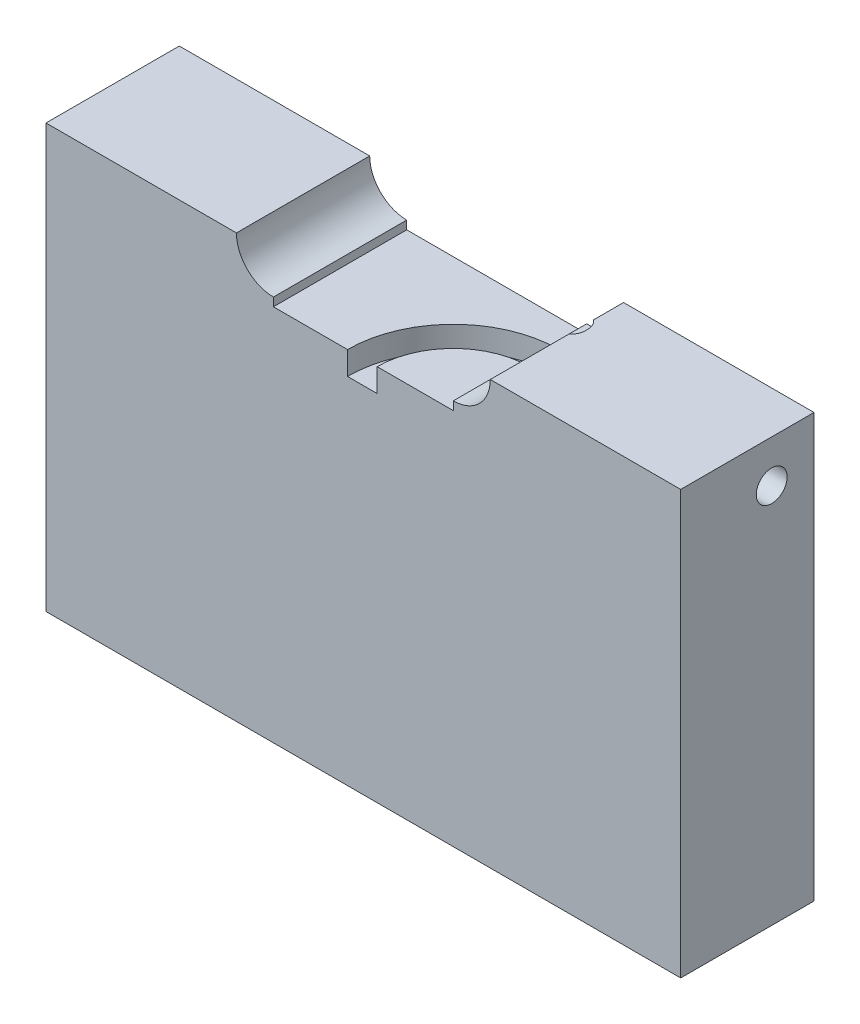
ISO-10303-21;
HEADER;
FILE_DESCRIPTION(('STEP AP214'),'2;1');
FILE_NAME('part.step','',(''),(''),'','','');
FILE_SCHEMA(('AUTOMOTIVE_DESIGN { 1 0 10303 214 1 1 1 1 }'));
ENDSEC;
DATA;
#1=APPLICATION_CONTEXT('core data for automotive mechanical design processes');
#2=APPLICATION_PROTOCOL_DEFINITION('international standard','automotive_design',2000,#1);
#3=PRODUCT_CONTEXT('',#1,'mechanical');
#4=PRODUCT('Part','Part','',(#3));
#5=PRODUCT_RELATED_PRODUCT_CATEGORY('part','',(#4));
#6=PRODUCT_DEFINITION_FORMATION('','',#4);
#7=PRODUCT_DEFINITION_CONTEXT('part definition',#1,'design');
#8=PRODUCT_DEFINITION('design','',#6,#7);
#9=PRODUCT_DEFINITION_SHAPE('','',#8);
#10=(LENGTH_UNIT() NAMED_UNIT(*) SI_UNIT(.MILLI.,.METRE.));
#11=(NAMED_UNIT(*) PLANE_ANGLE_UNIT() SI_UNIT($,.RADIAN.));
#12=(NAMED_UNIT(*) SI_UNIT($,.STERADIAN.) SOLID_ANGLE_UNIT());
#13=UNCERTAINTY_MEASURE_WITH_UNIT(LENGTH_MEASURE(1.E-05),#10,'distance_accuracy_value','');
#14=(GEOMETRIC_REPRESENTATION_CONTEXT(3) GLOBAL_UNCERTAINTY_ASSIGNED_CONTEXT((#13)) GLOBAL_UNIT_ASSIGNED_CONTEXT((#10,
#11,#12)) REPRESENTATION_CONTEXT('',''));
#15=CARTESIAN_POINT('',(0.,0.,0.));
#16=DIRECTION('',(0.,0.,1.));
#17=DIRECTION('',(1.,0.,0.));
#18=AXIS2_PLACEMENT_3D('',#15,#16,#17);
#19=CARTESIAN_POINT('',(5.3975,25.4,4.0005));
#20=DIRECTION('',(0.,-1.,0.));
#21=DIRECTION('',(1.,0.,0.));
#22=AXIS2_PLACEMENT_3D('',#19,#20,#21);
#23=CYLINDRICAL_SURFACE('',#22,6.35);
#24=DIRECTION('',(0.,-1.,0.));
#25=VECTOR('',#24,1.);
#26=CARTESIAN_POINT('',(5.3975,25.4,-2.3495));
#27=LINE('',#26,#25);
#28=CARTESIAN_POINT('',(5.3975,22.6695,-2.3495));
#29=VERTEX_POINT('',#28);
#30=CARTESIAN_POINT('',(5.3975,21.2725,-2.3495));
#31=VERTEX_POINT('',#30);
#32=EDGE_CURVE('E452',#29,#31,#27,.T.);
#33=ORIENTED_EDGE('',*,*,#32,.F.);
#34=CARTESIAN_POINT('',(5.3975,22.6695,4.0005));
#35=DIRECTION('',(0.,1.,0.));
#36=DIRECTION('',(-1.,0.,0.));
#37=AXIS2_PLACEMENT_3D('',#34,#35,#36);
#38=CIRCLE('',#37,6.35);
#39=CARTESIAN_POINT('',(-0.9525,22.6695,4.0005));
#40=VERTEX_POINT('',#39);
#41=EDGE_CURVE('E239',#29,#40,#38,.T.);
#42=ORIENTED_EDGE('',*,*,#41,.T.);
#43=DIRECTION('',(0.,-1.,0.));
#44=VECTOR('',#43,1.);
#45=CARTESIAN_POINT('',(-0.952499999999999,25.4,4.0005));
#46=LINE('',#45,#44);
#47=CARTESIAN_POINT('',(-0.952500000000001,21.2725,4.0005));
#48=VERTEX_POINT('',#47);
#49=EDGE_CURVE('E230',#40,#48,#46,.T.);
#50=ORIENTED_EDGE('',*,*,#49,.T.);
#51=CARTESIAN_POINT('',(5.3975,21.2725,4.0005));
#52=DIRECTION('',(0.,1.,0.));
#53=DIRECTION('',(-1.,0.,0.));
#54=AXIS2_PLACEMENT_3D('',#51,#52,#53);
#55=CIRCLE('',#54,6.35);
#56=EDGE_CURVE('E468',#31,#48,#55,.T.);
#57=ORIENTED_EDGE('',*,*,#56,.F.);
#58=EDGE_LOOP('',(#33,#42,#50,#57));
#59=FACE_BOUND('',#58,.T.);
#60=ADVANCED_FACE('F33',(#59),#23,.F.);
#61=CARTESIAN_POINT('',(5.3975,25.4,4.0005));
#62=DIRECTION('',(0.,-1.,0.));
#63=DIRECTION('',(1.,0.,0.));
#64=AXIS2_PLACEMENT_3D('',#61,#62,#63);
#65=CYLINDRICAL_SURFACE('',#64,4.572);
#66=DIRECTION('',(0.,-1.,0.));
#67=VECTOR('',#66,1.);
#68=CARTESIAN_POINT('',(0.825500000000001,25.4,4.0005));
#69=LINE('',#68,#67);
#70=CARTESIAN_POINT('',(0.8255,22.6695,4.0005));
#71=VERTEX_POINT('',#70);
#72=CARTESIAN_POINT('',(0.825499999999999,21.2725,4.0005));
#73=VERTEX_POINT('',#72);
#74=EDGE_CURVE('E450',#71,#73,#69,.T.);
#75=ORIENTED_EDGE('',*,*,#74,.F.);
#76=CARTESIAN_POINT('',(5.3975,22.6695,4.0005));
#77=DIRECTION('',(0.,1.,0.));
#78=DIRECTION('',(-1.,0.,0.));
#79=AXIS2_PLACEMENT_3D('',#76,#77,#78);
#80=CIRCLE('',#79,4.572);
#81=CARTESIAN_POINT('',(5.3975,22.6695,-0.571499999999999));
#82=VERTEX_POINT('',#81);
#83=EDGE_CURVE('E11',#71,#82,#80,.F.);
#84=ORIENTED_EDGE('',*,*,#83,.T.);
#85=DIRECTION('',(0.,-1.,0.));
#86=VECTOR('',#85,1.);
#87=CARTESIAN_POINT('',(5.3975,25.4,-0.571499999999999));
#88=LINE('',#87,#86);
#89=CARTESIAN_POINT('',(5.3975,21.2725,-0.571499999999999));
#90=VERTEX_POINT('',#89);
#91=EDGE_CURVE('E428',#82,#90,#88,.T.);
#92=ORIENTED_EDGE('',*,*,#91,.T.);
#93=CARTESIAN_POINT('',(5.3975,21.2725,4.0005));
#94=DIRECTION('',(0.,-1.,0.));
#95=DIRECTION('',(-1.,0.,0.));
#96=AXIS2_PLACEMENT_3D('',#93,#94,#95);
#97=CIRCLE('',#96,4.572);
#98=EDGE_CURVE('E444',#73,#90,#97,.T.);
#99=ORIENTED_EDGE('',*,*,#98,.F.);
#100=EDGE_LOOP('',(#75,#84,#92,#99));
#101=FACE_BOUND('',#100,.T.);
#102=ADVANCED_FACE('F515',(#101),#65,.T.);
#103=CARTESIAN_POINT('',(7.14375,25.4,-1.36525));
#104=DIRECTION('',(0.,-1.,0.));
#105=DIRECTION('',(1.,0.,0.));
#106=AXIS2_PLACEMENT_3D('',#103,#104,#105);
#107=CYLINDRICAL_SURFACE('',#106,0.79375);
#108=CARTESIAN_POINT('',(7.14375,23.1230464027505,-0.571499999999999));
#109=CARTESIAN_POINT('',(7.15893791785662,23.1229781622669,-0.57148921704763));
#110=CARTESIAN_POINT('',(7.17400569118337,23.124520458918,-0.571934888400934));
#111=CARTESIAN_POINT('',(7.2033431203434,23.1300966910771,-0.573609679749041));
#112=CARTESIAN_POINT('',(7.2176225803887,23.1340818079715,-0.574823464377439));
#113=CARTESIAN_POINT('',(7.25380469471549,23.1468082711699,-0.578843564999055));
#114=CARTESIAN_POINT('',(7.27512209176527,23.1569686475094,-0.582168697431571));
#115=CARTESIAN_POINT('',(7.31633968048021,23.1797623078841,-0.590203083478792));
#116=CARTESIAN_POINT('',(7.3362195987784,23.1924240312471,-0.594928600893243));
#117=CARTESIAN_POINT('',(7.37787042940221,23.2211125710446,-0.606458135167337));
#118=CARTESIAN_POINT('',(7.39943301006975,23.2373533586215,-0.613473986199112));
#119=CARTESIAN_POINT('',(7.44138305141542,23.270593693588,-0.629075213734984));
#120=CARTESIAN_POINT('',(7.46176933083153,23.2875939742988,-0.637662133053712));
#121=CARTESIAN_POINT('',(7.52143193640342,23.3389203174978,-0.665728056056787));
#122=CARTESIAN_POINT('',(7.5593005677582,23.3736393239732,-0.687537596010284));
#123=CARTESIAN_POINT('',(7.6384185132863,23.448430775985,-0.742299278746401));
#124=CARTESIAN_POINT('',(7.67896795887997,23.4882846809269,-0.776574581298044));
#125=CARTESIAN_POINT('',(7.75403094099642,23.5640168410449,-0.854840077472445));
#126=CARTESIAN_POINT('',(7.78855810799547,23.5999040050053,-0.898807808999805));
#127=CARTESIAN_POINT('',(7.83769152755565,23.6526476479051,-0.97824481695104));
#128=CARTESIAN_POINT('',(7.85491185054323,23.6715928274382,-1.01071440914583));
#129=CARTESIAN_POINT('',(7.88511096397852,23.7059280219605,-1.07921260408973));
#130=CARTESIAN_POINT('',(7.89810333803432,23.721329374934,-1.11522931488016));
#131=CARTESIAN_POINT('',(7.91781786866114,23.7462994434745,-1.18619777652733));
#132=CARTESIAN_POINT('',(7.92506881061526,23.7563207127409,-1.22083829691442));
#133=CARTESIAN_POINT('',(7.93245517265906,23.768352232104,-1.27409390820124));
#134=CARTESIAN_POINT('',(7.93433608261142,23.7718715687023,-1.29214513676568));
#135=CARTESIAN_POINT('',(7.93686009185863,23.7778440916586,-1.3285246385013));
#136=CARTESIAN_POINT('',(7.93750208529729,23.7802963240094,-1.34685314447942));
#137=CARTESIAN_POINT('',(7.9375,23.782194040048,-1.36525));
#138=B_SPLINE_CURVE_WITH_KNOTS('',3,(#108,#109,#110,#111,#112,#113,#114,#115,#116,#117,#118,
#119,#120,#121,#122,#123,#124,#125,#126,#127,#128,#129,#130,#131,#132,#133,#134,#135,#136,#137),
.UNSPECIFIED.,.F.,.F.,(4,2,2,2,2,2,2,2,2,2,2,2,2,2,4),(0.,0.0452895664750743,0.0897022840237438,
0.160849075138673,0.232856893385683,0.316417547963794,0.400060705247954,0.567007309525601,
0.765293828106061,0.963125562501132,1.08674096362218,1.2099551978823,1.31975004138663,
1.37514445888962,1.43058829859037),.UNSPECIFIED.);
#139=CARTESIAN_POINT('',(7.14375,23.1230464027505,-0.571499999999999));
#140=VERTEX_POINT('',#139);
#141=CARTESIAN_POINT('',(7.9375,23.782194040048,-1.36525));
#142=VERTEX_POINT('',#141);
#143=EDGE_CURVE('E288',#140,#142,#138,.T.);
#144=ORIENTED_EDGE('',*,*,#143,.F.);
#145=DIRECTION('',(0.,-1.,0.));
#146=VECTOR('',#145,1.);
#147=CARTESIAN_POINT('',(7.14375,25.4,-0.571499999999999));
#148=LINE('',#147,#146);
#149=CARTESIAN_POINT('',(7.14375,24.0251846714922,-0.571499999999999));
#150=VERTEX_POINT('',#149);
#151=EDGE_CURVE('E420',#150,#140,#148,.T.);
#152=ORIENTED_EDGE('',*,*,#151,.F.);
#153=CARTESIAN_POINT('',(7.14375,24.0251846714922,-0.571499999999999));
#154=CARTESIAN_POINT('',(7.17493882903404,24.0647904593139,-0.571515966067028));
#155=CARTESIAN_POINT('',(7.20473558813774,24.1054189700609,-0.573336101510383));
#156=CARTESIAN_POINT('',(7.26136996565832,24.1883868944046,-0.579743127296266));
#157=CARTESIAN_POINT('',(7.28821258149453,24.2307232477426,-0.58432525746599));
#158=CARTESIAN_POINT('',(7.3389098633342,24.316975133551,-0.595428843915839));
#159=CARTESIAN_POINT('',(7.36275997006245,24.3608929475555,-0.601953209514282));
#160=CARTESIAN_POINT('',(7.40738778736858,24.4500808312739,-0.616195180263885));
#161=CARTESIAN_POINT('',(7.4281640525646,24.4953515251891,-0.623913343295498));
#162=CARTESIAN_POINT('',(7.48841301880205,24.6391746871459,-0.648856798326211));
#163=CARTESIAN_POINT('',(7.52239504808017,24.7399758849743,-0.666944970405778));
#164=CARTESIAN_POINT('',(7.56234987491672,24.89428448952,-0.690674889170688));
#165=CARTESIAN_POINT('',(7.57382524483121,24.9461801786835,-0.698011648198737));
#166=CARTESIAN_POINT('',(7.59305267803054,25.0508824439455,-0.710803547908302));
#167=CARTESIAN_POINT('',(7.6008067955423,25.1036885007802,-0.716259726248792));
#168=CARTESIAN_POINT('',(7.61108668898027,25.1970681393693,-0.723637621390587));
#169=CARTESIAN_POINT('',(7.6144233283184,25.2375119988091,-0.726094970736021));
#170=CARTESIAN_POINT('',(7.61888265518496,25.3186335235272,-0.729411979066943));
#171=CARTESIAN_POINT('',(7.62000273710662,25.359311407665,-0.730269757657389));
#172=CARTESIAN_POINT('',(7.62,25.4,-0.730250000000001));
#173=B_SPLINE_CURVE_WITH_KNOTS('',3,(#153,#154,#155,#156,#157,#158,#159,#160,#161,#162,#163,
#164,#165,#166,#167,#168,#169,#170,#171,#172),.UNSPECIFIED.,.F.,.F.,(4,2,2,2,2,2,2,2,2,4),(0.,
0.151091968467235,0.301924278346462,0.452983670059184,0.604113868697302,0.926493060198708,
1.08733203777103,1.2480821256733,1.36996150858661,1.49198407820245),.UNSPECIFIED.);
#174=CARTESIAN_POINT('',(7.62,25.4,-0.730250000000001));
#175=VERTEX_POINT('',#174);
#176=EDGE_CURVE('E310',#150,#175,#173,.T.);
#177=ORIENTED_EDGE('',*,*,#176,.T.);
#178=CARTESIAN_POINT('',(7.14375,25.4,-1.36525));
#179=DIRECTION('',(0.,1.,0.));
#180=DIRECTION('',(1.,0.,0.));
#181=AXIS2_PLACEMENT_3D('',#178,#179,#180);
#182=CIRCLE('',#181,0.79375);
#183=CARTESIAN_POINT('',(7.9375,25.4,-1.36525));
#184=VERTEX_POINT('',#183);
#185=EDGE_CURVE('E438',#175,#184,#182,.T.);
#186=ORIENTED_EDGE('',*,*,#185,.T.);
#187=DIRECTION('',(0.,-1.,0.));
#188=VECTOR('',#187,1.);
#189=CARTESIAN_POINT('',(7.9375,25.4,-1.36525));
#190=LINE('',#189,#188);
#191=EDGE_CURVE('E355',#184,#142,#190,.T.);
#192=ORIENTED_EDGE('',*,*,#191,.T.);
#193=EDGE_LOOP('',(#144,#152,#177,#186,#192));
#194=FACE_BOUND('',#193,.T.);
#195=ADVANCED_FACE('F302',(#194),#107,.F.);
#196=CARTESIAN_POINT('',(7.14375,25.4,-1.55575));
#197=DIRECTION('',(0.,-1.,0.));
#198=DIRECTION('',(1.,0.,0.));
#199=AXIS2_PLACEMENT_3D('',#196,#197,#198);
#200=CYLINDRICAL_SURFACE('',#199,0.79375);
#201=CARTESIAN_POINT('',(7.9375,23.782194040048,-1.55575));
#202=CARTESIAN_POINT('',(7.93750241256332,23.7801936525798,-1.57514478348495));
#203=CARTESIAN_POINT('',(7.93678870871886,23.7775767551003,-1.5944621743929));
#204=CARTESIAN_POINT('',(7.93398641219166,23.7711587801819,-1.63277953405351));
#205=CARTESIAN_POINT('',(7.93189915885152,23.7673588582055,-1.65177979355258));
#206=CARTESIAN_POINT('',(7.92371352293545,23.7543339271178,-1.70775715508424));
#207=CARTESIAN_POINT('',(7.91568889593077,23.7434433707352,-1.74408855282001));
#208=CARTESIAN_POINT('',(7.89523776010599,23.7179176659708,-1.81387248338225));
#209=CARTESIAN_POINT('',(7.88282703010999,23.7032959918654,-1.8473348082929));
#210=CARTESIAN_POINT('',(7.85435108605226,23.6709943364583,-1.9111502135495));
#211=CARTESIAN_POINT('',(7.83827706911013,23.6533070133269,-1.9414955446917));
#212=CARTESIAN_POINT('',(7.7950458041358,23.6068268517615,-2.01212150391445));
#213=CARTESIAN_POINT('',(7.76620526596445,23.5766872046281,-2.05048526942747));
#214=CARTESIAN_POINT('',(7.7038617611406,23.5131883580013,-2.12011411534587));
#215=CARTESIAN_POINT('',(7.67034850885851,23.4798221071251,-2.1513631238535));
#216=CARTESIAN_POINT('',(7.59865541927082,23.4104677895308,-2.20785803437785));
#217=CARTESIAN_POINT('',(7.56037261542772,23.3744328617208,-2.23291527401671));
#218=CARTESIAN_POINT('',(7.50013032175957,23.3206006600362,-2.26536164838984));
#219=CARTESIAN_POINT('',(7.47959277776842,23.3027037493227,-2.27531618012629));
#220=CARTESIAN_POINT('',(7.43740812370541,23.2673727822183,-2.29353925463318));
#221=CARTESIAN_POINT('',(7.41576180347948,23.249938409412,-2.30180897725127));
#222=CARTESIAN_POINT('',(7.37545059999081,23.2195567149893,-2.31516497950012));
#223=CARTESIAN_POINT('',(7.35704266951005,23.206403873353,-2.32055739616009));
#224=CARTESIAN_POINT('',(7.31896103433901,23.1815037640402,-2.33017004709823));
#225=CARTESIAN_POINT('',(7.29928734644972,23.169756477713,-2.33439029693117));
#226=CARTESIAN_POINT('',(7.26442510912181,23.1521227309386,-2.34040819331776));
#227=CARTESIAN_POINT('',(7.2496600372804,23.1455350172339,-2.34255282231827));
#228=CARTESIAN_POINT('',(7.21928974650044,23.134519893377,-2.34604332277608));
#229=CARTESIAN_POINT('',(7.20368955538529,23.1300808834197,-2.34739349186303));
#230=CARTESIAN_POINT('',(7.18055609109638,23.1258076177804,-2.34867942917183));
#231=CARTESIAN_POINT('',(7.17325894960944,23.1247822406778,-2.34898501857166));
#232=CARTESIAN_POINT('',(7.15856018619976,23.1233972488647,-2.34939622095228));
#233=CARTESIAN_POINT('',(7.15115822518164,23.1230409698786,-2.34950083203409));
#234=CARTESIAN_POINT('',(7.14375,23.1230464027505,-2.3495));
#235=B_SPLINE_CURVE_WITH_KNOTS('',3,(#201,#202,#203,#204,#205,#206,#207,#208,#209,#210,#211,
#212,#213,#214,#215,#216,#217,#218,#219,#220,#221,#222,#223,#224,#225,#226,#227,#228,#229,#230,
#231,#232,#233,#234),.UNSPECIFIED.,.F.,.F.,(4,2,2,2,2,2,2,2,2,2,2,2,2,2,2,2,4),(0.,
0.0584453265147484,0.116833747504299,0.232488737897986,0.347731829907224,0.463254826944109,
0.632339979221334,0.801803378714479,0.975925812136694,1.06288483108186,1.14978274295621,
1.21949579483512,1.28920792157083,1.33802178064912,1.38656909412918,1.40866379827516,
1.43086836401874),.UNSPECIFIED.);
#236=CARTESIAN_POINT('',(7.9375,23.782194040048,-1.55575));
#237=VERTEX_POINT('',#236);
#238=CARTESIAN_POINT('',(7.14375,23.1230464027505,-2.3495));
#239=VERTEX_POINT('',#238);
#240=EDGE_CURVE('E283',#237,#239,#235,.T.);
#241=ORIENTED_EDGE('',*,*,#240,.F.);
#242=DIRECTION('',(0.,-1.,0.));
#243=VECTOR('',#242,1.);
#244=CARTESIAN_POINT('',(7.9375,25.4,-1.55575));
#245=LINE('',#244,#243);
#246=CARTESIAN_POINT('',(7.9375,25.4,-1.55575));
#247=VERTEX_POINT('',#246);
#248=EDGE_CURVE('E345',#247,#237,#245,.T.);
#249=ORIENTED_EDGE('',*,*,#248,.F.);
#250=CARTESIAN_POINT('',(7.14375,25.4,-1.55575));
#251=DIRECTION('',(0.,1.,0.));
#252=DIRECTION('',(-1.,0.,0.));
#253=AXIS2_PLACEMENT_3D('',#250,#251,#252);
#254=CIRCLE('',#253,0.79375);
#255=CARTESIAN_POINT('',(7.62,25.4,-2.19075));
#256=VERTEX_POINT('',#255);
#257=EDGE_CURVE('E441',#247,#256,#254,.T.);
#258=ORIENTED_EDGE('',*,*,#257,.T.);
#259=CARTESIAN_POINT('',(7.62,25.4,-2.19075));
#260=CARTESIAN_POINT('',(7.62000808222504,25.3476620086764,-2.19069678540611));
#261=CARTESIAN_POINT('',(7.61815174304964,25.2953473715379,-2.19213629686457));
#262=CARTESIAN_POINT('',(7.61078125391763,25.1911829924741,-2.19758908145641));
#263=CARTESIAN_POINT('',(7.60527233116839,25.1393326933517,-2.20159867627471));
#264=CARTESIAN_POINT('',(7.59066211493761,25.0363268479517,-2.21178576557001));
#265=CARTESIAN_POINT('',(7.58155825030525,24.9851718260926,-2.21796481131604));
#266=CARTESIAN_POINT('',(7.55984658447069,24.8838125931217,-2.23181870998652));
#267=CARTESIAN_POINT('',(7.5472375453096,24.8336087246421,-2.23949409110067));
#268=CARTESIAN_POINT('',(7.50289921844771,24.6799016765049,-2.26443820747756));
#269=CARTESIAN_POINT('',(7.46535418005992,24.5782472369929,-2.2830066799425));
#270=CARTESIAN_POINT('',(7.37568261057651,24.3812061917664,-2.31636202096677));
#271=CARTESIAN_POINT('',(7.32360883953244,24.2857984212855,-2.33116220863326));
#272=CARTESIAN_POINT('',(7.2458227786617,24.1653311257623,-2.3431368661238));
#273=CARTESIAN_POINT('',(7.22636452973083,24.1366863514485,-2.34544747485569));
#274=CARTESIAN_POINT('',(7.18607326983955,24.0802594935604,-2.34862852535922));
#275=CARTESIAN_POINT('',(7.16523897881772,24.0524782496364,-2.34949760595795));
#276=CARTESIAN_POINT('',(7.14375,24.0251846714922,-2.3495));
#277=B_SPLINE_CURVE_WITH_KNOTS('',3,(#259,#260,#261,#262,#263,#264,#265,#266,#267,#268,#269,
#270,#271,#272,#273,#274,#275,#276),.UNSPECIFIED.,.F.,.F.,(4,2,2,2,2,2,2,2,4),(0.,
0.156923704265639,0.313623318561808,0.470435210112986,0.627302555066314,0.955983364493301,
1.28348578985539,1.38754499314609,1.49170239923896),.UNSPECIFIED.);
#278=CARTESIAN_POINT('',(7.14375,24.0251846714922,-2.3495));
#279=VERTEX_POINT('',#278);
#280=EDGE_CURVE('E321',#256,#279,#277,.T.);
#281=ORIENTED_EDGE('',*,*,#280,.T.);
#282=DIRECTION('',(0.,-1.,0.));
#283=VECTOR('',#282,1.);
#284=CARTESIAN_POINT('',(7.14375,25.4,-2.3495));
#285=LINE('',#284,#283);
#286=EDGE_CURVE('E348',#279,#239,#285,.T.);
#287=ORIENTED_EDGE('',*,*,#286,.T.);
#288=EDGE_LOOP('',(#241,#249,#258,#281,#287));
#289=FACE_BOUND('',#288,.T.);
#290=ADVANCED_FACE('F344',(#289),#200,.F.);
#291=CARTESIAN_POINT('',(7.9375,25.4,-1.36525));
#292=DIRECTION('',(-1.,0.,0.));
#293=DIRECTION('',(0.,-1.,0.));
#294=AXIS2_PLACEMENT_3D('',#291,#292,#293);
#295=PLANE('',#294);
#296=CARTESIAN_POINT('',(7.9375,22.86,-1.4605));
#297=DIRECTION('',(-1.,0.,0.));
#298=DIRECTION('',(0.,-1.,0.));
#299=AXIS2_PLACEMENT_3D('',#296,#297,#298);
#300=CIRCLE('',#299,0.9271);
#301=EDGE_CURVE('E327',#142,#237,#300,.T.);
#302=ORIENTED_EDGE('',*,*,#301,.F.);
#303=ORIENTED_EDGE('',*,*,#191,.F.);
#304=DIRECTION('',(0.,0.,-1.));
#305=VECTOR('',#304,1.);
#306=CARTESIAN_POINT('',(7.9375,25.4,-1.36525));
#307=LINE('',#306,#305);
#308=EDGE_CURVE('E351',#184,#247,#307,.T.);
#309=ORIENTED_EDGE('',*,*,#308,.T.);
#310=ORIENTED_EDGE('',*,*,#248,.T.);
#311=EDGE_LOOP('',(#302,#303,#309,#310));
#312=FACE_BOUND('',#311,.T.);
#313=ADVANCED_FACE('F349',(#312),#295,.T.);
#314=CARTESIAN_POINT('',(-19.05,25.4,4.0005));
#315=DIRECTION('',(0.,0.,-1.));
#316=DIRECTION('',(-1.,0.,0.));
#317=AXIS2_PLACEMENT_3D('',#314,#315,#316);
#318=PLANE('',#317);
#319=DIRECTION('',(1.,0.,0.));
#320=VECTOR('',#319,1.);
#321=CARTESIAN_POINT('',(-5.3975,22.6695,4.0005));
#322=LINE('',#321,#320);
#323=CARTESIAN_POINT('',(-5.3975,22.6695,4.0005));
#324=VERTEX_POINT('',#323);
#325=EDGE_CURVE('E221',#324,#40,#322,.T.);
#326=ORIENTED_EDGE('',*,*,#325,.F.);
#327=DIRECTION('',(0.,1.,0.));
#328=VECTOR('',#327,1.);
#329=CARTESIAN_POINT('',(-5.3975,22.6695,4.0005));
#330=LINE('',#329,#328);
#331=CARTESIAN_POINT('',(-5.3975,23.1775,4.0005));
#332=VERTEX_POINT('',#331);
#333=EDGE_CURVE('E205',#324,#332,#330,.T.);
#334=ORIENTED_EDGE('',*,*,#333,.T.);
#335=CARTESIAN_POINT('',(-5.3975,25.4,4.0005));
#336=DIRECTION('',(0.,0.,-1.));
#337=DIRECTION('',(-1.,0.,0.));
#338=AXIS2_PLACEMENT_3D('',#335,#336,#337);
#339=CIRCLE('',#338,2.2225);
#340=CARTESIAN_POINT('',(-7.62,25.4,4.0005));
#341=VERTEX_POINT('',#340);
#342=EDGE_CURVE('E372',#332,#341,#339,.T.);
#343=ORIENTED_EDGE('',*,*,#342,.T.);
#344=DIRECTION('',(1.,0.,0.));
#345=VECTOR('',#344,1.);
#346=CARTESIAN_POINT('',(-19.05,25.4,4.0005));
#347=LINE('',#346,#345);
#348=CARTESIAN_POINT('',(-19.05,25.4,4.0005));
#349=VERTEX_POINT('',#348);
#350=EDGE_CURVE('E386',#349,#341,#347,.T.);
#351=ORIENTED_EDGE('',*,*,#350,.F.);
#352=DIRECTION('',(0.,-1.,0.));
#353=VECTOR('',#352,1.);
#354=CARTESIAN_POINT('',(-19.05,25.4,4.0005));
#355=LINE('',#354,#353);
#356=CARTESIAN_POINT('',(-19.05,0.,4.0005));
#357=VERTEX_POINT('',#356);
#358=EDGE_CURVE('E399',#349,#357,#355,.T.);
#359=ORIENTED_EDGE('',*,*,#358,.T.);
#360=DIRECTION('',(1.,0.,0.));
#361=VECTOR('',#360,1.);
#362=CARTESIAN_POINT('',(-19.05,0.,4.0005));
#363=LINE('',#362,#361);
#364=CARTESIAN_POINT('',(19.05,0.,4.0005));
#365=VERTEX_POINT('',#364);
#366=EDGE_CURVE('E379',#357,#365,#363,.T.);
#367=ORIENTED_EDGE('',*,*,#366,.T.);
#368=DIRECTION('',(0.,-1.,0.));
#369=VECTOR('',#368,1.);
#370=CARTESIAN_POINT('',(19.05,25.4,4.0005));
#371=LINE('',#370,#369);
#372=CARTESIAN_POINT('',(19.05,25.4,4.0005));
#373=VERTEX_POINT('',#372);
#374=EDGE_CURVE('E389',#373,#365,#371,.T.);
#375=ORIENTED_EDGE('',*,*,#374,.F.);
#376=CARTESIAN_POINT('',(7.61999999999999,25.4,4.0005));
#377=VERTEX_POINT('',#376);
#378=EDGE_CURVE('E385',#377,#373,#347,.T.);
#379=ORIENTED_EDGE('',*,*,#378,.F.);
#380=CARTESIAN_POINT('',(5.3975,25.4,4.0005));
#381=DIRECTION('',(0.,0.,-1.));
#382=DIRECTION('',(-1.,0.,0.));
#383=AXIS2_PLACEMENT_3D('',#380,#381,#382);
#384=CIRCLE('',#383,2.2225);
#385=CARTESIAN_POINT('',(5.3975,23.1775,4.0005));
#386=VERTEX_POINT('',#385);
#387=EDGE_CURVE('E367',#377,#386,#384,.T.);
#388=ORIENTED_EDGE('',*,*,#387,.T.);
#389=DIRECTION('',(0.,1.,0.));
#390=VECTOR('',#389,1.);
#391=CARTESIAN_POINT('',(5.3975,22.6695,4.0005));
#392=LINE('',#391,#390);
#393=CARTESIAN_POINT('',(5.3975,22.6695,4.0005));
#394=VERTEX_POINT('',#393);
#395=EDGE_CURVE('E216',#394,#386,#392,.T.);
#396=ORIENTED_EDGE('',*,*,#395,.F.);
#397=EDGE_CURVE('E225',#71,#394,#322,.T.);
#398=ORIENTED_EDGE('',*,*,#397,.F.);
#399=ORIENTED_EDGE('',*,*,#74,.T.);
#400=DIRECTION('',(1.,0.,0.));
#401=VECTOR('',#400,1.);
#402=CARTESIAN_POINT('',(0.825499999999999,21.2725,4.0005));
#403=LINE('',#402,#401);
#404=EDGE_CURVE('E471',#48,#73,#403,.T.);
#405=ORIENTED_EDGE('',*,*,#404,.F.);
#406=ORIENTED_EDGE('',*,*,#49,.F.);
#407=EDGE_LOOP('',(#326,#334,#343,#351,#359,#367,#375,#379,#388,#396,#398,#399,#405,#406));
#408=FACE_BOUND('',#407,.T.);
#409=ADVANCED_FACE('F228',(#408),#318,.F.);
#410=CARTESIAN_POINT('',(0.,25.4,0.));
#411=DIRECTION('',(0.,-1.,0.));
#412=DIRECTION('',(0.,0.,-1.));
#413=AXIS2_PLACEMENT_3D('',#410,#411,#412);
#414=PLANE('',#413);
#415=ORIENTED_EDGE('',*,*,#185,.F.);
#416=DIRECTION('',(0.,0.,-1.));
#417=VECTOR('',#416,1.);
#418=CARTESIAN_POINT('',(7.62,25.4,21.3995));
#419=LINE('',#418,#417);
#420=EDGE_CURVE('E408',#175,#377,#419,.F.);
#421=ORIENTED_EDGE('',*,*,#420,.T.);
#422=ORIENTED_EDGE('',*,*,#378,.T.);
#423=DIRECTION('',(0.,0.,-1.));
#424=VECTOR('',#423,1.);
#425=CARTESIAN_POINT('',(19.05,25.4,4.0005));
#426=LINE('',#425,#424);
#427=CARTESIAN_POINT('',(19.05,25.4,-4.0005));
#428=VERTEX_POINT('',#427);
#429=EDGE_CURVE('E375',#373,#428,#426,.T.);
#430=ORIENTED_EDGE('',*,*,#429,.T.);
#431=DIRECTION('',(-1.,0.,0.));
#432=VECTOR('',#431,1.);
#433=CARTESIAN_POINT('',(-19.05,25.4,-4.0005));
#434=LINE('',#433,#432);
#435=CARTESIAN_POINT('',(7.62,25.4,-4.0005));
#436=VERTEX_POINT('',#435);
#437=EDGE_CURVE('E380',#428,#436,#434,.T.);
#438=ORIENTED_EDGE('',*,*,#437,.T.);
#439=EDGE_CURVE('E409',#436,#256,#419,.F.);
#440=ORIENTED_EDGE('',*,*,#439,.T.);
#441=ORIENTED_EDGE('',*,*,#257,.F.);
#442=ORIENTED_EDGE('',*,*,#308,.F.);
#443=EDGE_LOOP('',(#415,#421,#422,#430,#438,#440,#441,#442));
#444=FACE_BOUND('',#443,.T.);
#445=ADVANCED_FACE('F436',(#444),#414,.F.);
#446=CARTESIAN_POINT('',(5.3975,25.4,21.3995));
#447=DIRECTION('',(0.,0.,-1.));
#448=DIRECTION('',(-1.,0.,0.));
#449=AXIS2_PLACEMENT_3D('',#446,#447,#448);
#450=CYLINDRICAL_SURFACE('',#449,2.2225);
#451=ORIENTED_EDGE('',*,*,#280,.F.);
#452=ORIENTED_EDGE('',*,*,#439,.F.);
#453=CARTESIAN_POINT('',(5.3975,25.4,-4.0005));
#454=DIRECTION('',(0.,0.,-1.));
#455=DIRECTION('',(-1.,0.,0.));
#456=AXIS2_PLACEMENT_3D('',#453,#454,#455);
#457=CIRCLE('',#456,2.2225);
#458=CARTESIAN_POINT('',(5.3975,23.1775,-4.0005));
#459=VERTEX_POINT('',#458);
#460=EDGE_CURVE('E362',#436,#459,#457,.T.);
#461=ORIENTED_EDGE('',*,*,#460,.T.);
#462=DIRECTION('',(0.,0.,-1.));
#463=VECTOR('',#462,1.);
#464=CARTESIAN_POINT('',(5.3975,23.1775,21.3995));
#465=LINE('',#464,#463);
#466=CARTESIAN_POINT('',(5.3975,23.1775,-2.3495));
#467=VERTEX_POINT('',#466);
#468=EDGE_CURVE('E365',#467,#459,#465,.T.);
#469=ORIENTED_EDGE('',*,*,#468,.F.);
#470=CARTESIAN_POINT('',(5.3975,25.4,-2.3495));
#471=DIRECTION('',(0.,0.,1.));
#472=DIRECTION('',(1.,0.,0.));
#473=AXIS2_PLACEMENT_3D('',#470,#471,#472);
#474=CIRCLE('',#473,2.2225);
#475=EDGE_CURVE('E316',#279,#467,#474,.F.);
#476=ORIENTED_EDGE('',*,*,#475,.F.);
#477=EDGE_LOOP('',(#451,#452,#461,#469,#476));
#478=FACE_BOUND('',#477,.T.);
#479=ADVANCED_FACE('F304',(#478),#450,.F.);
#480=ORIENTED_EDGE('',*,*,#176,.F.);
#481=CARTESIAN_POINT('',(5.3975,25.4,-0.571499999999999));
#482=DIRECTION('',(0.,0.,-1.));
#483=DIRECTION('',(-1.,0.,0.));
#484=AXIS2_PLACEMENT_3D('',#481,#482,#483);
#485=CIRCLE('',#484,2.2225);
#486=CARTESIAN_POINT('',(5.3975,23.1775,-0.571499999999999));
#487=VERTEX_POINT('',#486);
#488=EDGE_CURVE('E317',#487,#150,#485,.F.);
#489=ORIENTED_EDGE('',*,*,#488,.F.);
#490=EDGE_CURVE('E368',#386,#487,#465,.T.);
#491=ORIENTED_EDGE('',*,*,#490,.F.);
#492=ORIENTED_EDGE('',*,*,#387,.F.);
#493=ORIENTED_EDGE('',*,*,#420,.F.);
#494=EDGE_LOOP('',(#480,#489,#491,#492,#493));
#495=FACE_BOUND('',#494,.T.);
#496=ADVANCED_FACE('F432',(#495),#450,.F.);
#497=ORIENTED_EDGE('',*,*,#350,.T.);
#498=DIRECTION('',(0.,0.,-1.));
#499=VECTOR('',#498,1.);
#500=CARTESIAN_POINT('',(-7.62,25.4,21.3995));
#501=LINE('',#500,#499);
#502=CARTESIAN_POINT('',(-7.62,25.4,-4.0005));
#503=VERTEX_POINT('',#502);
#504=EDGE_CURVE('E411',#341,#503,#501,.T.);
#505=ORIENTED_EDGE('',*,*,#504,.T.);
#506=CARTESIAN_POINT('',(-19.05,25.4,-4.0005));
#507=VERTEX_POINT('',#506);
#508=EDGE_CURVE('E378',#503,#507,#434,.T.);
#509=ORIENTED_EDGE('',*,*,#508,.T.);
#510=DIRECTION('',(0.,0.,1.));
#511=VECTOR('',#510,1.);
#512=CARTESIAN_POINT('',(-19.05,25.4,4.0005));
#513=LINE('',#512,#511);
#514=EDGE_CURVE('E383',#507,#349,#513,.T.);
#515=ORIENTED_EDGE('',*,*,#514,.T.);
#516=EDGE_LOOP('',(#497,#505,#509,#515));
#517=FACE_BOUND('',#516,.T.);
#518=ADVANCED_FACE('F572',(#517),#414,.F.);
#519=CARTESIAN_POINT('',(19.05,25.4,4.0005));
#520=DIRECTION('',(-1.,0.,0.));
#521=DIRECTION('',(0.,0.,1.));
#522=AXIS2_PLACEMENT_3D('',#519,#520,#521);
#523=PLANE('',#522);
#524=CARTESIAN_POINT('',(19.05,22.86,-1.4605));
#525=DIRECTION('',(1.,0.,0.));
#526=DIRECTION('',(0.,0.,-1.));
#527=AXIS2_PLACEMENT_3D('',#524,#525,#526);
#528=CIRCLE('',#527,0.9271);
#529=CARTESIAN_POINT('',(19.05,22.86,-2.3876));
#530=VERTEX_POINT('',#529);
#531=EDGE_CURVE('E245',#530,#530,#528,.T.);
#532=ORIENTED_EDGE('',*,*,#531,.F.);
#533=EDGE_LOOP('',(#532));
#534=FACE_BOUND('',#533,.T.);
#535=DIRECTION('',(0.,0.,-1.));
#536=VECTOR('',#535,1.);
#537=CARTESIAN_POINT('',(19.05,0.,4.0005));
#538=LINE('',#537,#536);
#539=CARTESIAN_POINT('',(19.05,0.,-4.0005));
#540=VERTEX_POINT('',#539);
#541=EDGE_CURVE('E374',#365,#540,#538,.T.);
#542=ORIENTED_EDGE('',*,*,#541,.T.);
#543=DIRECTION('',(0.,-1.,0.));
#544=VECTOR('',#543,1.);
#545=CARTESIAN_POINT('',(19.05,25.4,-4.0005));
#546=LINE('',#545,#544);
#547=EDGE_CURVE('E405',#428,#540,#546,.T.);
#548=ORIENTED_EDGE('',*,*,#547,.F.);
#549=ORIENTED_EDGE('',*,*,#429,.F.);
#550=ORIENTED_EDGE('',*,*,#374,.T.);
#551=EDGE_LOOP('',(#542,#548,#549,#550));
#552=FACE_BOUND('',#551,.T.);
#553=ADVANCED_FACE('F35',(#534,#552),#523,.F.);
#554=CARTESIAN_POINT('',(-19.05,25.4,-4.0005));
#555=DIRECTION('',(0.,0.,1.));
#556=DIRECTION('',(1.,0.,0.));
#557=AXIS2_PLACEMENT_3D('',#554,#555,#556);
#558=PLANE('',#557);
#559=CARTESIAN_POINT('',(-5.3975,25.4,-4.0005));
#560=DIRECTION('',(0.,0.,-1.));
#561=DIRECTION('',(-1.,0.,0.));
#562=AXIS2_PLACEMENT_3D('',#559,#560,#561);
#563=CIRCLE('',#562,2.2225);
#564=CARTESIAN_POINT('',(-5.3975,23.1775,-4.0005));
#565=VERTEX_POINT('',#564);
#566=EDGE_CURVE('E360',#565,#503,#563,.T.);
#567=ORIENTED_EDGE('',*,*,#566,.F.);
#568=DIRECTION('',(0.,1.,0.));
#569=VECTOR('',#568,1.);
#570=CARTESIAN_POINT('',(-5.3975,22.6695,-4.0005));
#571=LINE('',#570,#569);
#572=CARTESIAN_POINT('',(-5.3975,22.6695,-4.0005));
#573=VERTEX_POINT('',#572);
#574=EDGE_CURVE('E237',#573,#565,#571,.T.);
#575=ORIENTED_EDGE('',*,*,#574,.F.);
#576=DIRECTION('',(-1.,0.,0.));
#577=VECTOR('',#576,1.);
#578=CARTESIAN_POINT('',(-5.3975,22.6695,-4.0005));
#579=LINE('',#578,#577);
#580=CARTESIAN_POINT('',(5.3975,22.6695,-4.0005));
#581=VERTEX_POINT('',#580);
#582=EDGE_CURVE('E217',#581,#573,#579,.T.);
#583=ORIENTED_EDGE('',*,*,#582,.F.);
#584=DIRECTION('',(0.,1.,0.));
#585=VECTOR('',#584,1.);
#586=CARTESIAN_POINT('',(5.3975,22.6695,-4.0005));
#587=LINE('',#586,#585);
#588=EDGE_CURVE('E240',#581,#459,#587,.T.);
#589=ORIENTED_EDGE('',*,*,#588,.T.);
#590=ORIENTED_EDGE('',*,*,#460,.F.);
#591=ORIENTED_EDGE('',*,*,#437,.F.);
#592=ORIENTED_EDGE('',*,*,#547,.T.);
#593=DIRECTION('',(-1.,0.,0.));
#594=VECTOR('',#593,1.);
#595=CARTESIAN_POINT('',(-19.05,0.,-4.0005));
#596=LINE('',#595,#594);
#597=CARTESIAN_POINT('',(-19.05,0.,-4.0005));
#598=VERTEX_POINT('',#597);
#599=EDGE_CURVE('E392',#540,#598,#596,.T.);
#600=ORIENTED_EDGE('',*,*,#599,.T.);
#601=DIRECTION('',(0.,-1.,0.));
#602=VECTOR('',#601,1.);
#603=CARTESIAN_POINT('',(-19.05,25.4,-4.0005));
#604=LINE('',#603,#602);
#605=EDGE_CURVE('E402',#507,#598,#604,.T.);
#606=ORIENTED_EDGE('',*,*,#605,.F.);
#607=ORIENTED_EDGE('',*,*,#508,.F.);
#608=EDGE_LOOP('',(#567,#575,#583,#589,#590,#591,#592,#600,#606,#607));
#609=FACE_BOUND('',#608,.T.);
#610=ADVANCED_FACE('F578',(#609),#558,.F.);
#611=CARTESIAN_POINT('',(-19.05,25.4,4.0005));
#612=DIRECTION('',(1.,0.,0.));
#613=DIRECTION('',(0.,0.,-1.));
#614=AXIS2_PLACEMENT_3D('',#611,#612,#613);
#615=PLANE('',#614);
#616=DIRECTION('',(0.,0.,1.));
#617=VECTOR('',#616,1.);
#618=CARTESIAN_POINT('',(-19.05,0.,4.0005));
#619=LINE('',#618,#617);
#620=EDGE_CURVE('E394',#598,#357,#619,.T.);
#621=ORIENTED_EDGE('',*,*,#620,.T.);
#622=ORIENTED_EDGE('',*,*,#358,.F.);
#623=ORIENTED_EDGE('',*,*,#514,.F.);
#624=ORIENTED_EDGE('',*,*,#605,.T.);
#625=EDGE_LOOP('',(#621,#622,#623,#624));
#626=FACE_BOUND('',#625,.T.);
#627=ADVANCED_FACE('F583',(#626),#615,.F.);
#628=CARTESIAN_POINT('',(0.,0.,0.));
#629=DIRECTION('',(0.,-1.,0.));
#630=DIRECTION('',(0.,0.,-1.));
#631=AXIS2_PLACEMENT_3D('',#628,#629,#630);
#632=PLANE('',#631);
#633=ORIENTED_EDGE('',*,*,#541,.F.);
#634=ORIENTED_EDGE('',*,*,#366,.F.);
#635=ORIENTED_EDGE('',*,*,#620,.F.);
#636=ORIENTED_EDGE('',*,*,#599,.F.);
#637=EDGE_LOOP('',(#633,#634,#635,#636));
#638=FACE_BOUND('',#637,.T.);
#639=ADVANCED_FACE('F594',(#638),#632,.T.);
#640=CARTESIAN_POINT('',(-5.3975,25.4,21.3995));
#641=DIRECTION('',(0.,0.,-1.));
#642=DIRECTION('',(-1.,0.,0.));
#643=AXIS2_PLACEMENT_3D('',#640,#641,#642);
#644=CYLINDRICAL_SURFACE('',#643,2.2225);
#645=DIRECTION('',(0.,0.,-1.));
#646=VECTOR('',#645,1.);
#647=CARTESIAN_POINT('',(-5.3975,23.1775,21.3995));
#648=LINE('',#647,#646);
#649=EDGE_CURVE('E211',#332,#565,#648,.T.);
#650=ORIENTED_EDGE('',*,*,#649,.T.);
#651=ORIENTED_EDGE('',*,*,#566,.T.);
#652=ORIENTED_EDGE('',*,*,#504,.F.);
#653=ORIENTED_EDGE('',*,*,#342,.F.);
#654=EDGE_LOOP('',(#650,#651,#652,#653));
#655=FACE_BOUND('',#654,.T.);
#656=ADVANCED_FACE('F300',(#655),#644,.F.);
#657=CARTESIAN_POINT('',(7.9375,21.937805959952,-1.36525));
#658=CARTESIAN_POINT('',(7.93750241256332,21.9398063474202,-1.34585521651505));
#659=CARTESIAN_POINT('',(7.93678870871886,21.9424232448997,-1.3265378256071));
#660=CARTESIAN_POINT('',(7.93398641219166,21.9488412198181,-1.28822046594649));
#661=CARTESIAN_POINT('',(7.93189915885152,21.9526411417945,-1.26922020644742));
#662=CARTESIAN_POINT('',(7.92371352293545,21.9656660728822,-1.21324284491576));
#663=CARTESIAN_POINT('',(7.91568889593077,21.9765566292647,-1.17691144717999));
#664=CARTESIAN_POINT('',(7.89523776010599,22.0020823340292,-1.10712751661774));
#665=CARTESIAN_POINT('',(7.88282703010999,22.0167040081346,-1.0736651917071));
#666=CARTESIAN_POINT('',(7.85435108605226,22.0490056635417,-1.0098497864505));
#667=CARTESIAN_POINT('',(7.83827706911013,22.0666929866731,-0.979504455308302));
#668=CARTESIAN_POINT('',(7.7950458041358,22.1131731482385,-0.908878496085548));
#669=CARTESIAN_POINT('',(7.76620526596444,22.1433127953719,-0.870514730572526));
#670=CARTESIAN_POINT('',(7.7038617611406,22.2068116419987,-0.80088588465413));
#671=CARTESIAN_POINT('',(7.67034850885851,22.2401778928749,-0.769636876146502));
#672=CARTESIAN_POINT('',(7.59865541927082,22.3095322104692,-0.713141965622146));
#673=CARTESIAN_POINT('',(7.56037261542772,22.3455671382792,-0.688084725983286));
#674=CARTESIAN_POINT('',(7.50013032175957,22.3993993399638,-0.655638351610156));
#675=CARTESIAN_POINT('',(7.47959277776843,22.4172962506773,-0.645683819873712));
#676=CARTESIAN_POINT('',(7.43740812370541,22.4526272177817,-0.62746074536682));
#677=CARTESIAN_POINT('',(7.41576180347948,22.470061590588,-0.61919102274873));
#678=CARTESIAN_POINT('',(7.37545059999081,22.5004432850107,-0.605835020499883));
#679=CARTESIAN_POINT('',(7.35704266951006,22.513596126647,-0.60044260383991));
#680=CARTESIAN_POINT('',(7.31896103433902,22.5384962359598,-0.590829952901765));
#681=CARTESIAN_POINT('',(7.29928734644972,22.550243522287,-0.586609703068826));
#682=CARTESIAN_POINT('',(7.26442510912181,22.5678772690614,-0.580591806682241));
#683=CARTESIAN_POINT('',(7.2496600372804,22.5744649827661,-0.578447177681725));
#684=CARTESIAN_POINT('',(7.21928974650044,22.585480106623,-0.574956677223916));
#685=CARTESIAN_POINT('',(7.20368955538529,22.5899191165803,-0.573606508136971));
#686=CARTESIAN_POINT('',(7.18055609109638,22.5941923822196,-0.572320570828168));
#687=CARTESIAN_POINT('',(7.17325894960944,22.5952177593222,-0.572014981428341));
#688=CARTESIAN_POINT('',(7.15856018619976,22.5966027511353,-0.571603779047718));
#689=CARTESIAN_POINT('',(7.15115822518164,22.5969590301214,-0.571499167965912));
#690=CARTESIAN_POINT('',(7.14375,22.5969535972495,-0.571499999999999));
#691=B_SPLINE_CURVE_WITH_KNOTS('',3,(#657,#658,#659,#660,#661,#662,#663,#664,#665,#666,#667,
#668,#669,#670,#671,#672,#673,#674,#675,#676,#677,#678,#679,#680,#681,#682,#683,#684,#685,#686,
#687,#688,#689,#690),.UNSPECIFIED.,.F.,.F.,(4,2,2,2,2,2,2,2,2,2,2,2,2,2,2,2,4),(0.,
0.058445326514748,0.116833747504299,0.232488737897986,0.347731829907223,0.463254826944109,
0.63233997922134,0.80180337871448,0.975925812136693,1.06288483108186,1.14978274295621,
1.21949579483512,1.28920792157083,1.33802178064912,1.38656909412918,1.40866379827516,
1.43086836401874),.UNSPECIFIED.);
#692=CARTESIAN_POINT('',(7.9375,21.937805959952,-1.36525));
#693=VERTEX_POINT('',#692);
#694=CARTESIAN_POINT('',(7.14375,22.5969535972495,-0.571499999999999));
#695=VERTEX_POINT('',#694);
#696=EDGE_CURVE('E258',#693,#695,#691,.T.);
#697=ORIENTED_EDGE('',*,*,#696,.F.);
#698=CARTESIAN_POINT('',(7.9375,21.2725,-1.36525));
#699=VERTEX_POINT('',#698);
#700=EDGE_CURVE('E352',#693,#699,#190,.T.);
#701=ORIENTED_EDGE('',*,*,#700,.T.);
#702=CARTESIAN_POINT('',(7.14375,21.2725,-1.36525));
#703=DIRECTION('',(0.,1.,0.));
#704=DIRECTION('',(1.,0.,0.));
#705=AXIS2_PLACEMENT_3D('',#702,#703,#704);
#706=CIRCLE('',#705,0.79375);
#707=CARTESIAN_POINT('',(7.14375,21.2725,-0.571499999999999));
#708=VERTEX_POINT('',#707);
#709=EDGE_CURVE('E491',#708,#699,#706,.T.);
#710=ORIENTED_EDGE('',*,*,#709,.F.);
#711=EDGE_CURVE('E429',#695,#708,#148,.T.);
#712=ORIENTED_EDGE('',*,*,#711,.F.);
#713=EDGE_LOOP('',(#697,#701,#710,#712));
#714=FACE_BOUND('',#713,.T.);
#715=ADVANCED_FACE('F296',(#714),#107,.F.);
#716=CARTESIAN_POINT('',(7.14375,22.5969535972495,-2.3495));
#717=CARTESIAN_POINT('',(7.15893791785662,22.5970218377331,-2.34951078295237));
#718=CARTESIAN_POINT('',(7.17400569118337,22.595479541082,-2.34906511159906));
#719=CARTESIAN_POINT('',(7.2033431203434,22.5899033089228,-2.34739032025096));
#720=CARTESIAN_POINT('',(7.21762258038871,22.5859181920285,-2.34617653562256));
#721=CARTESIAN_POINT('',(7.25380469471549,22.57319172883,-2.34215643500094));
#722=CARTESIAN_POINT('',(7.27512209176527,22.5630313524906,-2.33883130256843));
#723=CARTESIAN_POINT('',(7.31633968048021,22.5402376921159,-2.33079691652121));
#724=CARTESIAN_POINT('',(7.3362195987784,22.5275759687529,-2.32607139910675));
#725=CARTESIAN_POINT('',(7.37787042940221,22.4988874289553,-2.31454186483266));
#726=CARTESIAN_POINT('',(7.39943301006976,22.4826466413785,-2.30752601380088));
#727=CARTESIAN_POINT('',(7.44138305141543,22.449406306412,-2.29192478626501));
#728=CARTESIAN_POINT('',(7.46176933083154,22.4324060257012,-2.28333786694628));
#729=CARTESIAN_POINT('',(7.52143193640342,22.3810796825022,-2.25527194394321));
#730=CARTESIAN_POINT('',(7.55930056775821,22.3463606760268,-2.23346240398971));
#731=CARTESIAN_POINT('',(7.63841851328631,22.271569224015,-2.17870072125359));
#732=CARTESIAN_POINT('',(7.67896795887998,22.2317153190731,-2.14442541870195));
#733=CARTESIAN_POINT('',(7.75403094099643,22.1559831589551,-2.06615992252754));
#734=CARTESIAN_POINT('',(7.78855810799548,22.1200959949947,-2.02219219100018));
#735=CARTESIAN_POINT('',(7.83769152755566,22.0673523520949,-1.94275518304895));
#736=CARTESIAN_POINT('',(7.85491185054323,22.0484071725618,-1.91028559085416));
#737=CARTESIAN_POINT('',(7.88511096397852,22.0140719780394,-1.84178739591025));
#738=CARTESIAN_POINT('',(7.89810333803432,21.998670625066,-1.80577068511982));
#739=CARTESIAN_POINT('',(7.91781786866114,21.9737005565255,-1.73480222347266));
#740=CARTESIAN_POINT('',(7.92506881061526,21.9636792872591,-1.70016170308557));
#741=CARTESIAN_POINT('',(7.93245517265906,21.951647767896,-1.64690609179876));
#742=CARTESIAN_POINT('',(7.93433608261142,21.9481284312977,-1.62885486323431));
#743=CARTESIAN_POINT('',(7.93686009185863,21.9421559083414,-1.59247536149869));
#744=CARTESIAN_POINT('',(7.93750208529729,21.9397036759906,-1.57414685552058));
#745=CARTESIAN_POINT('',(7.9375,21.937805959952,-1.55575));
#746=B_SPLINE_CURVE_WITH_KNOTS('',3,(#716,#717,#718,#719,#720,#721,#722,#723,#724,#725,#726,
#727,#728,#729,#730,#731,#732,#733,#734,#735,#736,#737,#738,#739,#740,#741,#742,#743,#744,#745),
.UNSPECIFIED.,.F.,.F.,(4,2,2,2,2,2,2,2,2,2,2,2,2,2,4),(0.,0.0452895664750731,0.0897022840237443,
0.160849075138677,0.232856893385687,0.316417547963805,0.400060705247965,0.567007309525613,
0.765293828106071,0.963125562501145,1.08674096362219,1.20995519788231,1.31975004138663,
1.37514445888962,1.43058829859037),.UNSPECIFIED.);
#747=CARTESIAN_POINT('',(7.14375,22.5969535972495,-2.3495));
#748=VERTEX_POINT('',#747);
#749=CARTESIAN_POINT('',(7.9375,21.937805959952,-1.55575));
#750=VERTEX_POINT('',#749);
#751=EDGE_CURVE('E56',#748,#750,#746,.T.);
#752=ORIENTED_EDGE('',*,*,#751,.F.);
#753=CARTESIAN_POINT('',(7.14375,21.2725,-2.3495));
#754=VERTEX_POINT('',#753);
#755=EDGE_CURVE('E455',#748,#754,#285,.T.);
#756=ORIENTED_EDGE('',*,*,#755,.T.);
#757=CARTESIAN_POINT('',(7.14375,21.2725,-1.55575));
#758=DIRECTION('',(0.,1.,0.));
#759=DIRECTION('',(-1.,0.,0.));
#760=AXIS2_PLACEMENT_3D('',#757,#758,#759);
#761=CIRCLE('',#760,0.79375);
#762=CARTESIAN_POINT('',(7.9375,21.2725,-1.55575));
#763=VERTEX_POINT('',#762);
#764=EDGE_CURVE('E476',#763,#754,#761,.T.);
#765=ORIENTED_EDGE('',*,*,#764,.F.);
#766=EDGE_CURVE('E353',#750,#763,#245,.T.);
#767=ORIENTED_EDGE('',*,*,#766,.F.);
#768=EDGE_LOOP('',(#752,#756,#765,#767));
#769=FACE_BOUND('',#768,.T.);
#770=ADVANCED_FACE('F264',(#769),#200,.F.);
#771=CARTESIAN_POINT('',(7.14375,25.4,-2.3495));
#772=DIRECTION('',(0.,0.,1.));
#773=DIRECTION('',(1.,0.,0.));
#774=AXIS2_PLACEMENT_3D('',#771,#772,#773);
#775=PLANE('',#774);
#776=DIRECTION('',(1.,0.,0.));
#777=VECTOR('',#776,1.);
#778=CARTESIAN_POINT('',(6.35,22.5969535972495,-2.3495));
#779=LINE('',#778,#777);
#780=CARTESIAN_POINT('',(6.35,22.5969535972495,-2.3495));
#781=VERTEX_POINT('',#780);
#782=EDGE_CURVE('E289',#781,#748,#779,.T.);
#783=ORIENTED_EDGE('',*,*,#782,.F.);
#784=DIRECTION('',(0.,1.,0.));
#785=VECTOR('',#784,1.);
#786=CARTESIAN_POINT('',(6.35,25.4,-2.3495));
#787=LINE('',#786,#785);
#788=CARTESIAN_POINT('',(6.35,23.1230464027505,-2.3495));
#789=VERTEX_POINT('',#788);
#790=EDGE_CURVE('E494',#781,#789,#787,.T.);
#791=ORIENTED_EDGE('',*,*,#790,.T.);
#792=DIRECTION('',(1.,0.,0.));
#793=VECTOR('',#792,1.);
#794=CARTESIAN_POINT('',(6.35,23.1230464027505,-2.3495));
#795=LINE('',#794,#793);
#796=EDGE_CURVE('E497',#239,#789,#795,.F.);
#797=ORIENTED_EDGE('',*,*,#796,.F.);
#798=ORIENTED_EDGE('',*,*,#286,.F.);
#799=ORIENTED_EDGE('',*,*,#475,.T.);
#800=EDGE_CURVE('E453',#467,#29,#27,.T.);
#801=ORIENTED_EDGE('',*,*,#800,.T.);
#802=ORIENTED_EDGE('',*,*,#32,.T.);
#803=DIRECTION('',(-1.,0.,0.));
#804=VECTOR('',#803,1.);
#805=CARTESIAN_POINT('',(7.14375,21.2725,-2.3495));
#806=LINE('',#805,#804);
#807=EDGE_CURVE('E464',#754,#31,#806,.T.);
#808=ORIENTED_EDGE('',*,*,#807,.F.);
#809=ORIENTED_EDGE('',*,*,#755,.F.);
#810=EDGE_LOOP('',(#783,#791,#797,#798,#799,#801,#802,#808,#809));
#811=FACE_BOUND('',#810,.T.);
#812=ADVANCED_FACE('F461',(#811),#775,.T.);
#813=CARTESIAN_POINT('',(5.3975,25.4,-0.571499999999999));
#814=DIRECTION('',(0.,0.,-1.));
#815=DIRECTION('',(-1.,0.,0.));
#816=AXIS2_PLACEMENT_3D('',#813,#814,#815);
#817=PLANE('',#816);
#818=DIRECTION('',(1.,0.,0.));
#819=VECTOR('',#818,1.);
#820=CARTESIAN_POINT('',(6.35,23.1230464027505,-0.571499999999999));
#821=LINE('',#820,#819);
#822=CARTESIAN_POINT('',(6.35,23.1230464027505,-0.571499999999999));
#823=VERTEX_POINT('',#822);
#824=EDGE_CURVE('E294',#823,#140,#821,.T.);
#825=ORIENTED_EDGE('',*,*,#824,.F.);
#826=DIRECTION('',(0.,-1.,0.));
#827=VECTOR('',#826,1.);
#828=CARTESIAN_POINT('',(6.35,25.4,-0.571499999999999));
#829=LINE('',#828,#827);
#830=CARTESIAN_POINT('',(6.35,22.5969535972495,-0.571499999999999));
#831=VERTEX_POINT('',#830);
#832=EDGE_CURVE('E41',#823,#831,#829,.T.);
#833=ORIENTED_EDGE('',*,*,#832,.T.);
#834=DIRECTION('',(1.,0.,0.));
#835=VECTOR('',#834,1.);
#836=CARTESIAN_POINT('',(6.35,22.5969535972495,-0.571499999999999));
#837=LINE('',#836,#835);
#838=EDGE_CURVE('E489',#695,#831,#837,.F.);
#839=ORIENTED_EDGE('',*,*,#838,.F.);
#840=ORIENTED_EDGE('',*,*,#711,.T.);
#841=DIRECTION('',(1.,0.,0.));
#842=VECTOR('',#841,1.);
#843=CARTESIAN_POINT('',(5.3975,21.2725,-0.571499999999999));
#844=LINE('',#843,#842);
#845=EDGE_CURVE('E439',#90,#708,#844,.T.);
#846=ORIENTED_EDGE('',*,*,#845,.F.);
#847=ORIENTED_EDGE('',*,*,#91,.F.);
#848=EDGE_CURVE('E422',#487,#82,#88,.T.);
#849=ORIENTED_EDGE('',*,*,#848,.F.);
#850=ORIENTED_EDGE('',*,*,#488,.T.);
#851=ORIENTED_EDGE('',*,*,#151,.T.);
#852=EDGE_LOOP('',(#825,#833,#839,#840,#846,#847,#849,#850,#851));
#853=FACE_BOUND('',#852,.T.);
#854=ADVANCED_FACE('F419',(#853),#817,.T.);
#855=EDGE_CURVE('E326',#750,#693,#300,.T.);
#856=ORIENTED_EDGE('',*,*,#855,.F.);
#857=ORIENTED_EDGE('',*,*,#766,.T.);
#858=DIRECTION('',(0.,0.,-1.));
#859=VECTOR('',#858,1.);
#860=CARTESIAN_POINT('',(7.9375,21.2725,-1.36525));
#861=LINE('',#860,#859);
#862=EDGE_CURVE('E478',#699,#763,#861,.T.);
#863=ORIENTED_EDGE('',*,*,#862,.F.);
#864=ORIENTED_EDGE('',*,*,#700,.F.);
#865=EDGE_LOOP('',(#856,#857,#863,#864));
#866=FACE_BOUND('',#865,.T.);
#867=ADVANCED_FACE('F303',(#866),#295,.T.);
#868=CARTESIAN_POINT('',(7.14375,21.2725,-1.36525));
#869=DIRECTION('',(0.,-1.,0.));
#870=DIRECTION('',(1.,0.,0.));
#871=AXIS2_PLACEMENT_3D('',#868,#869,#870);
#872=PLANE('',#871);
#873=ORIENTED_EDGE('',*,*,#709,.T.);
#874=ORIENTED_EDGE('',*,*,#862,.T.);
#875=ORIENTED_EDGE('',*,*,#764,.T.);
#876=ORIENTED_EDGE('',*,*,#807,.T.);
#877=ORIENTED_EDGE('',*,*,#56,.T.);
#878=ORIENTED_EDGE('',*,*,#404,.T.);
#879=ORIENTED_EDGE('',*,*,#98,.T.);
#880=ORIENTED_EDGE('',*,*,#845,.T.);
#881=EDGE_LOOP('',(#873,#874,#875,#876,#877,#878,#879,#880));
#882=FACE_BOUND('',#881,.T.);
#883=ADVANCED_FACE('F276',(#882),#872,.F.);
#884=CARTESIAN_POINT('',(6.35,22.86,-1.4605));
#885=DIRECTION('',(1.,0.,0.));
#886=DIRECTION('',(0.,0.,-1.));
#887=AXIS2_PLACEMENT_3D('',#884,#885,#886);
#888=PLANE('',#887);
#889=CARTESIAN_POINT('',(6.35,22.86,-1.4605));
#890=DIRECTION('',(1.,0.,0.));
#891=DIRECTION('',(0.,0.,-1.));
#892=AXIS2_PLACEMENT_3D('',#889,#890,#891);
#893=CIRCLE('',#892,0.9271);
#894=EDGE_CURVE('E246',#781,#789,#893,.T.);
#895=ORIENTED_EDGE('',*,*,#894,.T.);
#896=ORIENTED_EDGE('',*,*,#790,.F.);
#897=EDGE_LOOP('',(#895,#896));
#898=FACE_BOUND('',#897,.T.);
#899=ADVANCED_FACE('F274',(#898),#888,.T.);
#900=CARTESIAN_POINT('',(6.35,22.86,-1.4605));
#901=DIRECTION('',(1.,0.,0.));
#902=DIRECTION('',(0.,0.,-1.));
#903=AXIS2_PLACEMENT_3D('',#900,#901,#902);
#904=CYLINDRICAL_SURFACE('',#903,0.9271);
#905=ORIENTED_EDGE('',*,*,#796,.T.);
#906=ORIENTED_EDGE('',*,*,#894,.F.);
#907=ORIENTED_EDGE('',*,*,#782,.T.);
#908=ORIENTED_EDGE('',*,*,#751,.T.);
#909=ORIENTED_EDGE('',*,*,#855,.T.);
#910=ORIENTED_EDGE('',*,*,#696,.T.);
#911=ORIENTED_EDGE('',*,*,#838,.T.);
#912=EDGE_CURVE('E249',#823,#831,#893,.T.);
#913=ORIENTED_EDGE('',*,*,#912,.F.);
#914=ORIENTED_EDGE('',*,*,#824,.T.);
#915=ORIENTED_EDGE('',*,*,#143,.T.);
#916=ORIENTED_EDGE('',*,*,#301,.T.);
#917=ORIENTED_EDGE('',*,*,#240,.T.);
#918=EDGE_LOOP('',(#905,#906,#907,#908,#909,#910,#911,#913,#914,#915,#916,#917));
#919=FACE_BOUND('',#918,.T.);
#920=ORIENTED_EDGE('',*,*,#531,.T.);
#921=EDGE_LOOP('',(#920));
#922=FACE_BOUND('',#921,.T.);
#923=ADVANCED_FACE('F268',(#919,#922),#904,.F.);
#924=ORIENTED_EDGE('',*,*,#912,.T.);
#925=ORIENTED_EDGE('',*,*,#832,.F.);
#926=EDGE_LOOP('',(#924,#925));
#927=FACE_BOUND('',#926,.T.);
#928=ADVANCED_FACE('F273',(#927),#888,.T.);
#929=CARTESIAN_POINT('',(5.3975,22.6695,-4.0005));
#930=DIRECTION('',(1.,0.,0.));
#931=DIRECTION('',(0.,1.,0.));
#932=AXIS2_PLACEMENT_3D('',#929,#930,#931);
#933=PLANE('',#932);
#934=ORIENTED_EDGE('',*,*,#848,.T.);
#935=DIRECTION('',(0.,0.,-1.));
#936=VECTOR('',#935,1.);
#937=CARTESIAN_POINT('',(5.3975,22.6695,-4.0005));
#938=LINE('',#937,#936);
#939=EDGE_CURVE('E232',#394,#82,#938,.T.);
#940=ORIENTED_EDGE('',*,*,#939,.F.);
#941=ORIENTED_EDGE('',*,*,#395,.T.);
#942=ORIENTED_EDGE('',*,*,#490,.T.);
#943=EDGE_LOOP('',(#934,#940,#941,#942));
#944=FACE_BOUND('',#943,.T.);
#945=ADVANCED_FACE('F504',(#944),#933,.F.);
#946=CARTESIAN_POINT('',(0.,22.6695,0.));
#947=DIRECTION('',(0.,1.,0.));
#948=DIRECTION('',(-1.,0.,0.));
#949=AXIS2_PLACEMENT_3D('',#946,#947,#948);
#950=PLANE('',#949);
#951=ORIENTED_EDGE('',*,*,#397,.T.);
#952=ORIENTED_EDGE('',*,*,#939,.T.);
#953=ORIENTED_EDGE('',*,*,#83,.F.);
#954=EDGE_LOOP('',(#951,#952,#953));
#955=FACE_BOUND('',#954,.T.);
#956=ADVANCED_FACE('F508',(#955),#950,.T.);
#957=EDGE_CURVE('E48',#29,#581,#938,.T.);
#958=ORIENTED_EDGE('',*,*,#957,.T.);
#959=ORIENTED_EDGE('',*,*,#582,.T.);
#960=DIRECTION('',(0.,0.,1.));
#961=VECTOR('',#960,1.);
#962=CARTESIAN_POINT('',(-5.3975,22.6695,-4.0005));
#963=LINE('',#962,#961);
#964=EDGE_CURVE('E208',#573,#324,#963,.T.);
#965=ORIENTED_EDGE('',*,*,#964,.T.);
#966=ORIENTED_EDGE('',*,*,#325,.T.);
#967=ORIENTED_EDGE('',*,*,#41,.F.);
#968=EDGE_LOOP('',(#958,#959,#965,#966,#967));
#969=FACE_BOUND('',#968,.T.);
#970=ADVANCED_FACE('F220',(#969),#950,.T.);
#971=ORIENTED_EDGE('',*,*,#800,.F.);
#972=ORIENTED_EDGE('',*,*,#468,.T.);
#973=ORIENTED_EDGE('',*,*,#588,.F.);
#974=ORIENTED_EDGE('',*,*,#957,.F.);
#975=EDGE_LOOP('',(#971,#972,#973,#974));
#976=FACE_BOUND('',#975,.T.);
#977=ADVANCED_FACE('F511',(#976),#933,.F.);
#978=CARTESIAN_POINT('',(-5.3975,22.6695,-4.0005));
#979=DIRECTION('',(-1.,0.,0.));
#980=DIRECTION('',(0.,-1.,0.));
#981=AXIS2_PLACEMENT_3D('',#978,#979,#980);
#982=PLANE('',#981);
#983=ORIENTED_EDGE('',*,*,#649,.F.);
#984=ORIENTED_EDGE('',*,*,#333,.F.);
#985=ORIENTED_EDGE('',*,*,#964,.F.);
#986=ORIENTED_EDGE('',*,*,#574,.T.);
#987=EDGE_LOOP('',(#983,#984,#985,#986));
#988=FACE_BOUND('',#987,.T.);
#989=ADVANCED_FACE('F207',(#988),#982,.F.);
#990=CLOSED_SHELL('',(#60,#102,#195,#290,#313,#409,#445,#479,#496,#518,#553,#610,#627,#639,#656,
#715,#770,#812,#854,#867,#883,#899,#923,#928,#945,#956,#970,#977,#989));
#991=MANIFOLD_SOLID_BREP('B2',#990);
#992=ADVANCED_BREP_SHAPE_REPRESENTATION('',(#18,#991),#14);
#993=SHAPE_DEFINITION_REPRESENTATION(#9,#992);
ENDSEC;
END-ISO-10303-21;
